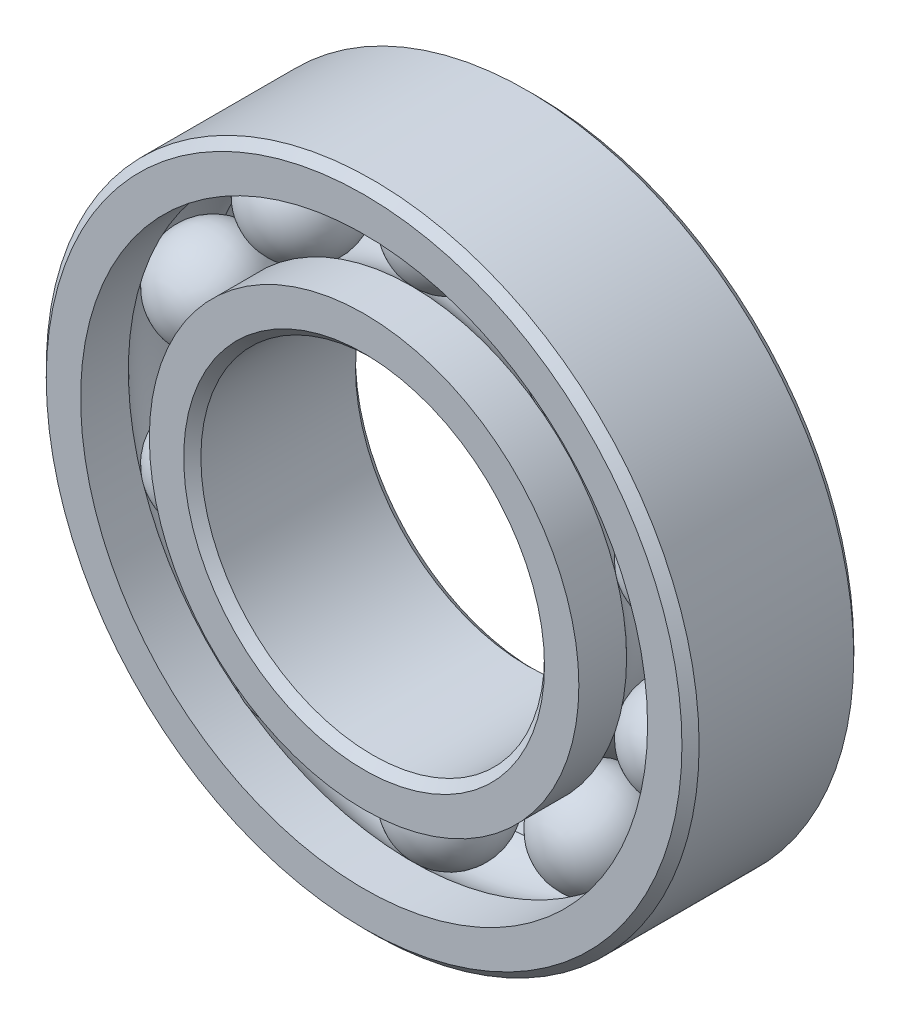
ISO-10303-21;
HEADER;
FILE_DESCRIPTION(('STEP AP214'),'2;1');
FILE_NAME('part.step','',(''),(''),'','','');
FILE_SCHEMA(('AUTOMOTIVE_DESIGN { 1 0 10303 214 1 1 1 1 }'));
ENDSEC;
DATA;
#1=APPLICATION_CONTEXT('core data for automotive mechanical design processes');
#2=APPLICATION_PROTOCOL_DEFINITION('international standard','automotive_design',2000,#1);
#3=PRODUCT_CONTEXT('',#1,'mechanical');
#4=PRODUCT('Part','Part','',(#3));
#5=PRODUCT_RELATED_PRODUCT_CATEGORY('part','',(#4));
#6=PRODUCT_DEFINITION_FORMATION('','',#4);
#7=PRODUCT_DEFINITION_CONTEXT('part definition',#1,'design');
#8=PRODUCT_DEFINITION('design','',#6,#7);
#9=PRODUCT_DEFINITION_SHAPE('','',#8);
#10=(LENGTH_UNIT() NAMED_UNIT(*) SI_UNIT(.MILLI.,.METRE.));
#11=(NAMED_UNIT(*) PLANE_ANGLE_UNIT() SI_UNIT($,.RADIAN.));
#12=(NAMED_UNIT(*) SI_UNIT($,.STERADIAN.) SOLID_ANGLE_UNIT());
#13=UNCERTAINTY_MEASURE_WITH_UNIT(LENGTH_MEASURE(1.E-05),#10,'distance_accuracy_value','');
#14=(GEOMETRIC_REPRESENTATION_CONTEXT(3) GLOBAL_UNCERTAINTY_ASSIGNED_CONTEXT((#13)) GLOBAL_UNIT_ASSIGNED_CONTEXT((#10,
#11,#12)) REPRESENTATION_CONTEXT('',''));
#15=CARTESIAN_POINT('',(0.,0.,0.));
#16=DIRECTION('',(0.,0.,1.));
#17=DIRECTION('',(1.,0.,0.));
#18=AXIS2_PLACEMENT_3D('',#15,#16,#17);
#19=CARTESIAN_POINT('',(4.26144307912035,5.86537320921842,0.));
#20=DIRECTION('',(0.,0.,1.));
#21=DIRECTION('',(0.587785252292462,0.809016994374955,0.));
#22=AXIS2_PLACEMENT_3D('',#19,#20,#21);
#23=SPHERICAL_SURFACE('',#22,1.49484711634152);
#24=CARTESIAN_POINT('',(4.26144307912035,5.86537320921842,1.49484711634152));
#25=VERTEX_POINT('',#24);
#26=VERTEX_LOOP('',#25);
#27=FACE_BOUND('',#26,.T.);
#28=ADVANCED_FACE('F39',(#27),#23,.T.);
#29=CLOSED_SHELL('',(#28));
#30=MANIFOLD_SOLID_BREP('B2',#29);
#31=CARTESIAN_POINT('',(6.89515974313984,2.24037320921845,0.));
#32=DIRECTION('',(0.,0.,1.));
#33=DIRECTION('',(0.95105651629515,0.309016994374958,0.));
#34=AXIS2_PLACEMENT_3D('',#31,#32,#33);
#35=SPHERICAL_SURFACE('',#34,1.49484711634152);
#36=CARTESIAN_POINT('',(6.89515974313984,2.24037320921845,1.49484711634152));
#37=VERTEX_POINT('',#36);
#38=VERTEX_LOOP('',#37);
#39=FACE_BOUND('',#38,.T.);
#40=ADVANCED_FACE('F59',(#39),#35,.T.);
#41=CLOSED_SHELL('',(#40));
#42=MANIFOLD_SOLID_BREP('B6',#41);
#43=CARTESIAN_POINT('',(6.89515974313988,-2.2403732092183,0.));
#44=DIRECTION('',(0.,0.,1.));
#45=DIRECTION('',(0.951056516295157,-0.309016994374938,0.));
#46=AXIS2_PLACEMENT_3D('',#43,#44,#45);
#47=SPHERICAL_SURFACE('',#46,1.49484711634152);
#48=CARTESIAN_POINT('',(6.89515974313988,-2.2403732092183,1.49484711634152));
#49=VERTEX_POINT('',#48);
#50=VERTEX_LOOP('',#49);
#51=FACE_BOUND('',#50,.T.);
#52=ADVANCED_FACE('F79',(#51),#47,.T.);
#53=CLOSED_SHELL('',(#52));
#54=MANIFOLD_SOLID_BREP('B35',#53);
#55=CARTESIAN_POINT('',(4.26144307912048,-5.86537320921833,0.));
#56=DIRECTION('',(0.,0.,1.));
#57=DIRECTION('',(0.58778525229248,-0.809016994374942,0.));
#58=AXIS2_PLACEMENT_3D('',#55,#56,#57);
#59=SPHERICAL_SURFACE('',#58,1.49484711634152);
#60=CARTESIAN_POINT('',(4.26144307912048,-5.86537320921833,1.49484711634152));
#61=VERTEX_POINT('',#60);
#62=VERTEX_LOOP('',#61);
#63=FACE_BOUND('',#62,.T.);
#64=ADVANCED_FACE('F99',(#63),#59,.T.);
#65=CLOSED_SHELL('',(#64));
#66=MANIFOLD_SOLID_BREP('B55',#65);
#67=CARTESIAN_POINT('',(0.,-7.25,0.));
#68=DIRECTION('',(0.,0.,1.));
#69=DIRECTION('',(0.,-1.,0.));
#70=AXIS2_PLACEMENT_3D('',#67,#68,#69);
#71=SPHERICAL_SURFACE('',#70,1.49484711634152);
#72=CARTESIAN_POINT('',(0.,-7.25,1.49484711634152));
#73=VERTEX_POINT('',#72);
#74=VERTEX_LOOP('',#73);
#75=FACE_BOUND('',#74,.T.);
#76=ADVANCED_FACE('F119',(#75),#71,.T.);
#77=CLOSED_SHELL('',(#76));
#78=MANIFOLD_SOLID_BREP('B75',#77);
#79=CARTESIAN_POINT('',(-4.2614430791204,-5.86537320921839,0.));
#80=DIRECTION('',(0.,0.,1.));
#81=DIRECTION('',(-0.587785252292469,-0.809016994374951,0.));
#82=AXIS2_PLACEMENT_3D('',#79,#80,#81);
#83=SPHERICAL_SURFACE('',#82,1.49484711634152);
#84=CARTESIAN_POINT('',(-4.2614430791204,-5.86537320921839,1.49484711634152));
#85=VERTEX_POINT('',#84);
#86=VERTEX_LOOP('',#85);
#87=FACE_BOUND('',#86,.T.);
#88=ADVANCED_FACE('F139',(#87),#83,.T.);
#89=CLOSED_SHELL('',(#88));
#90=MANIFOLD_SOLID_BREP('B95',#89);
#91=CARTESIAN_POINT('',(-6.89515974313986,-2.2403732092184,0.));
#92=DIRECTION('',(0.,0.,1.));
#93=DIRECTION('',(-0.951056516295152,-0.309016994374952,0.));
#94=AXIS2_PLACEMENT_3D('',#91,#92,#93);
#95=SPHERICAL_SURFACE('',#94,1.49484711634152);
#96=CARTESIAN_POINT('',(-6.89515974313986,-2.2403732092184,1.49484711634152));
#97=VERTEX_POINT('',#96);
#98=VERTEX_LOOP('',#97);
#99=FACE_BOUND('',#98,.T.);
#100=ADVANCED_FACE('F159',(#99),#95,.T.);
#101=CLOSED_SHELL('',(#100));
#102=MANIFOLD_SOLID_BREP('B115',#101);
#103=CARTESIAN_POINT('',(-6.89515974313987,2.24037320921835,0.));
#104=DIRECTION('',(0.,0.,1.));
#105=DIRECTION('',(-0.951056516295155,0.309016994374945,0.));
#106=AXIS2_PLACEMENT_3D('',#103,#104,#105);
#107=SPHERICAL_SURFACE('',#106,1.49484711634152);
#108=CARTESIAN_POINT('',(-6.89515974313987,2.24037320921835,1.49484711634152));
#109=VERTEX_POINT('',#108);
#110=VERTEX_LOOP('',#109);
#111=FACE_BOUND('',#110,.T.);
#112=ADVANCED_FACE('F179',(#111),#107,.T.);
#113=CLOSED_SHELL('',(#112));
#114=MANIFOLD_SOLID_BREP('B135',#113);
#115=CARTESIAN_POINT('',(-4.26144307912044,5.86537320921836,0.));
#116=DIRECTION('',(0.,0.,1.));
#117=DIRECTION('',(-0.587785252292474,0.809016994374947,0.));
#118=AXIS2_PLACEMENT_3D('',#115,#116,#117);
#119=SPHERICAL_SURFACE('',#118,1.49484711634152);
#120=CARTESIAN_POINT('',(-4.26144307912044,5.86537320921836,1.49484711634152));
#121=VERTEX_POINT('',#120);
#122=VERTEX_LOOP('',#121);
#123=FACE_BOUND('',#122,.T.);
#124=ADVANCED_FACE('F199',(#123),#119,.T.);
#125=CLOSED_SHELL('',(#124));
#126=MANIFOLD_SOLID_BREP('B155',#125);
#127=CARTESIAN_POINT('',(0.,7.25,0.));
#128=DIRECTION('',(0.,0.,1.));
#129=DIRECTION('',(0.,1.,0.));
#130=AXIS2_PLACEMENT_3D('',#127,#128,#129);
#131=SPHERICAL_SURFACE('',#130,1.49484711634152);
#132=CARTESIAN_POINT('',(0.,7.25,1.49484711634152));
#133=VERTEX_POINT('',#132);
#134=VERTEX_LOOP('',#133);
#135=FACE_BOUND('',#134,.T.);
#136=ADVANCED_FACE('F221',(#135),#131,.T.);
#137=CLOSED_SHELL('',(#136));
#138=MANIFOLD_SOLID_BREP('B175',#137);
#139=CARTESIAN_POINT('',(0.,6.25,2.5));
#140=DIRECTION('',(0.,0.,-1.));
#141=DIRECTION('',(-1.,0.,0.));
#142=AXIS2_PLACEMENT_3D('',#139,#140,#141);
#143=PLANE('',#142);
#144=CARTESIAN_POINT('',(0.,0.,2.5));
#145=DIRECTION('',(0.,0.,1.));
#146=DIRECTION('',(1.,0.,0.));
#147=AXIS2_PLACEMENT_3D('',#144,#145,#146);
#148=CIRCLE('',#147,5.25);
#149=CARTESIAN_POINT('',(5.25,0.,2.5));
#150=VERTEX_POINT('',#149);
#151=EDGE_CURVE('E268',#150,#150,#148,.T.);
#152=ORIENTED_EDGE('',*,*,#151,.F.);
#153=EDGE_LOOP('',(#152));
#154=FACE_BOUND('',#153,.T.);
#155=CARTESIAN_POINT('',(0.,0.,2.5));
#156=DIRECTION('',(0.,0.,1.));
#157=DIRECTION('',(1.,0.,0.));
#158=AXIS2_PLACEMENT_3D('',#155,#156,#157);
#159=CIRCLE('',#158,6.25);
#160=CARTESIAN_POINT('',(6.25,0.,2.5));
#161=VERTEX_POINT('',#160);
#162=EDGE_CURVE('E220',#161,#161,#159,.T.);
#163=ORIENTED_EDGE('',*,*,#162,.T.);
#164=EDGE_LOOP('',(#163));
#165=FACE_BOUND('',#164,.T.);
#166=ADVANCED_FACE('F240',(#154,#165),#143,.F.);
#167=CARTESIAN_POINT('',(0.,0.,2.5));
#168=DIRECTION('',(0.,0.,1.));
#169=DIRECTION('',(1.,0.,0.));
#170=AXIS2_PLACEMENT_3D('',#167,#168,#169);
#171=CYLINDRICAL_SURFACE('',#170,6.25);
#172=ORIENTED_EDGE('',*,*,#162,.F.);
#173=EDGE_LOOP('',(#172));
#174=FACE_BOUND('',#173,.T.);
#175=CARTESIAN_POINT('',(0.,0.,1.11111111111111));
#176=DIRECTION('',(0.,0.,1.));
#177=DIRECTION('',(1.,0.,0.));
#178=AXIS2_PLACEMENT_3D('',#175,#176,#177);
#179=CIRCLE('',#178,6.25);
#180=CARTESIAN_POINT('',(6.25,0.,1.11111111111111));
#181=VERTEX_POINT('',#180);
#182=EDGE_CURVE('E246',#181,#181,#179,.T.);
#183=ORIENTED_EDGE('',*,*,#182,.T.);
#184=EDGE_LOOP('',(#183));
#185=FACE_BOUND('',#184,.T.);
#186=ADVANCED_FACE('F275',(#174,#185),#171,.T.);
#187=CARTESIAN_POINT('',(0.,0.,0.));
#188=DIRECTION('',(0.,0.,1.));
#189=DIRECTION('',(1.,0.,0.));
#190=AXIS2_PLACEMENT_3D('',#187,#188,#189);
#191=TOROIDAL_SURFACE('',#190,7.25,1.49484711634152);
#192=ORIENTED_EDGE('',*,*,#182,.F.);
#193=EDGE_LOOP('',(#192));
#194=FACE_BOUND('',#193,.T.);
#195=CARTESIAN_POINT('',(0.,0.,-1.11111111111111));
#196=DIRECTION('',(0.,0.,1.));
#197=DIRECTION('',(1.,0.,0.));
#198=AXIS2_PLACEMENT_3D('',#195,#196,#197);
#199=CIRCLE('',#198,6.25);
#200=CARTESIAN_POINT('',(6.25,0.,-1.11111111111111));
#201=VERTEX_POINT('',#200);
#202=EDGE_CURVE('E250',#201,#201,#199,.T.);
#203=ORIENTED_EDGE('',*,*,#202,.T.);
#204=EDGE_LOOP('',(#203));
#205=FACE_BOUND('',#204,.T.);
#206=ADVANCED_FACE('F279',(#194,#205),#191,.F.);
#207=CARTESIAN_POINT('',(0.,0.,2.5));
#208=DIRECTION('',(0.,0.,1.));
#209=DIRECTION('',(1.,0.,0.));
#210=AXIS2_PLACEMENT_3D('',#207,#208,#209);
#211=CYLINDRICAL_SURFACE('',#210,6.25);
#212=ORIENTED_EDGE('',*,*,#202,.F.);
#213=EDGE_LOOP('',(#212));
#214=FACE_BOUND('',#213,.T.);
#215=CARTESIAN_POINT('',(0.,0.,-2.5));
#216=DIRECTION('',(0.,0.,1.));
#217=DIRECTION('',(1.,0.,0.));
#218=AXIS2_PLACEMENT_3D('',#215,#216,#217);
#219=CIRCLE('',#218,6.25);
#220=CARTESIAN_POINT('',(6.25,0.,-2.5));
#221=VERTEX_POINT('',#220);
#222=EDGE_CURVE('E254',#221,#221,#219,.T.);
#223=ORIENTED_EDGE('',*,*,#222,.T.);
#224=EDGE_LOOP('',(#223));
#225=FACE_BOUND('',#224,.T.);
#226=ADVANCED_FACE('F284',(#214,#225),#211,.T.);
#227=CARTESIAN_POINT('',(0.,5.25,-2.5));
#228=DIRECTION('',(0.,0.,1.));
#229=DIRECTION('',(1.,0.,0.));
#230=AXIS2_PLACEMENT_3D('',#227,#228,#229);
#231=PLANE('',#230);
#232=ORIENTED_EDGE('',*,*,#222,.F.);
#233=EDGE_LOOP('',(#232));
#234=FACE_BOUND('',#233,.T.);
#235=CARTESIAN_POINT('',(0.,0.,-2.5));
#236=DIRECTION('',(0.,0.,1.));
#237=DIRECTION('',(1.,0.,0.));
#238=AXIS2_PLACEMENT_3D('',#235,#236,#237);
#239=CIRCLE('',#238,5.25);
#240=CARTESIAN_POINT('',(5.25,0.,-2.5));
#241=VERTEX_POINT('',#240);
#242=EDGE_CURVE('E259',#241,#241,#239,.T.);
#243=ORIENTED_EDGE('',*,*,#242,.T.);
#244=EDGE_LOOP('',(#243));
#245=FACE_BOUND('',#244,.T.);
#246=ADVANCED_FACE('F290',(#234,#245),#231,.F.);
#247=CARTESIAN_POINT('',(0.,0.,-2.25));
#248=DIRECTION('',(0.,0.,-1.));
#249=DIRECTION('',(-1.,0.,0.));
#250=AXIS2_PLACEMENT_3D('',#247,#248,#249);
#251=CONICAL_SURFACE('',#250,5.,0.785398163397438);
#252=ORIENTED_EDGE('',*,*,#242,.F.);
#253=EDGE_LOOP('',(#252));
#254=FACE_BOUND('',#253,.T.);
#255=CARTESIAN_POINT('',(0.,0.,-2.25));
#256=DIRECTION('',(0.,0.,1.));
#257=DIRECTION('',(1.,0.,0.));
#258=AXIS2_PLACEMENT_3D('',#255,#256,#257);
#259=CIRCLE('',#258,5.);
#260=CARTESIAN_POINT('',(5.,0.,-2.25));
#261=VERTEX_POINT('',#260);
#262=EDGE_CURVE('E262',#261,#261,#259,.T.);
#263=ORIENTED_EDGE('',*,*,#262,.T.);
#264=EDGE_LOOP('',(#263));
#265=FACE_BOUND('',#264,.T.);
#266=ADVANCED_FACE('F294',(#254,#265),#251,.F.);
#267=CARTESIAN_POINT('',(0.,0.,2.5));
#268=DIRECTION('',(0.,0.,1.));
#269=DIRECTION('',(1.,0.,0.));
#270=AXIS2_PLACEMENT_3D('',#267,#268,#269);
#271=CYLINDRICAL_SURFACE('',#270,5.);
#272=ORIENTED_EDGE('',*,*,#262,.F.);
#273=EDGE_LOOP('',(#272));
#274=FACE_BOUND('',#273,.T.);
#275=CARTESIAN_POINT('',(0.,0.,2.25000000000001));
#276=DIRECTION('',(0.,0.,1.));
#277=DIRECTION('',(1.,0.,0.));
#278=AXIS2_PLACEMENT_3D('',#275,#276,#277);
#279=CIRCLE('',#278,5.);
#280=CARTESIAN_POINT('',(5.,0.,2.25000000000001));
#281=VERTEX_POINT('',#280);
#282=EDGE_CURVE('E265',#281,#281,#279,.T.);
#283=ORIENTED_EDGE('',*,*,#282,.T.);
#284=EDGE_LOOP('',(#283));
#285=FACE_BOUND('',#284,.T.);
#286=ADVANCED_FACE('F298',(#274,#285),#271,.F.);
#287=CARTESIAN_POINT('',(0.,0.,2.5));
#288=DIRECTION('',(0.,0.,1.));
#289=DIRECTION('',(1.,0.,0.));
#290=AXIS2_PLACEMENT_3D('',#287,#288,#289);
#291=CONICAL_SURFACE('',#290,5.25,0.785398163397458);
#292=ORIENTED_EDGE('',*,*,#282,.F.);
#293=EDGE_LOOP('',(#292));
#294=FACE_BOUND('',#293,.T.);
#295=ORIENTED_EDGE('',*,*,#151,.T.);
#296=EDGE_LOOP('',(#295));
#297=FACE_BOUND('',#296,.T.);
#298=ADVANCED_FACE('F272',(#294,#297),#291,.F.);
#299=CLOSED_SHELL('',(#166,#186,#206,#226,#246,#266,#286,#298));
#300=MANIFOLD_SOLID_BREP('B195',#299);
#301=CARTESIAN_POINT('',(0.,0.,2.25));
#302=DIRECTION('',(0.,0.,-1.));
#303=DIRECTION('',(-1.,0.,0.));
#304=AXIS2_PLACEMENT_3D('',#301,#302,#303);
#305=CONICAL_SURFACE('',#304,9.5,0.785398163397443);
#306=CARTESIAN_POINT('',(0.,0.,2.5));
#307=DIRECTION('',(0.,0.,1.));
#308=DIRECTION('',(1.,0.,0.));
#309=AXIS2_PLACEMENT_3D('',#306,#307,#308);
#310=CIRCLE('',#309,9.25);
#311=CARTESIAN_POINT('',(9.25,0.,2.5));
#312=VERTEX_POINT('',#311);
#313=EDGE_CURVE('E389',#312,#312,#310,.T.);
#314=ORIENTED_EDGE('',*,*,#313,.F.);
#315=EDGE_LOOP('',(#314));
#316=FACE_BOUND('',#315,.T.);
#317=CARTESIAN_POINT('',(0.,0.,2.25));
#318=DIRECTION('',(0.,0.,1.));
#319=DIRECTION('',(1.,0.,0.));
#320=AXIS2_PLACEMENT_3D('',#317,#318,#319);
#321=CIRCLE('',#320,9.5);
#322=CARTESIAN_POINT('',(9.5,0.,2.25));
#323=VERTEX_POINT('',#322);
#324=EDGE_CURVE('E239',#323,#323,#321,.T.);
#325=ORIENTED_EDGE('',*,*,#324,.T.);
#326=EDGE_LOOP('',(#325));
#327=FACE_BOUND('',#326,.T.);
#328=ADVANCED_FACE('F361',(#316,#327),#305,.T.);
#329=CARTESIAN_POINT('',(0.,0.,2.5));
#330=DIRECTION('',(0.,0.,1.));
#331=DIRECTION('',(1.,0.,0.));
#332=AXIS2_PLACEMENT_3D('',#329,#330,#331);
#333=CYLINDRICAL_SURFACE('',#332,9.5);
#334=ORIENTED_EDGE('',*,*,#324,.F.);
#335=EDGE_LOOP('',(#334));
#336=FACE_BOUND('',#335,.T.);
#337=CARTESIAN_POINT('',(0.,0.,-2.25));
#338=DIRECTION('',(0.,0.,1.));
#339=DIRECTION('',(1.,0.,0.));
#340=AXIS2_PLACEMENT_3D('',#337,#338,#339);
#341=CIRCLE('',#340,9.5);
#342=CARTESIAN_POINT('',(9.5,0.,-2.25));
#343=VERTEX_POINT('',#342);
#344=EDGE_CURVE('E367',#343,#343,#341,.T.);
#345=ORIENTED_EDGE('',*,*,#344,.T.);
#346=EDGE_LOOP('',(#345));
#347=FACE_BOUND('',#346,.T.);
#348=ADVANCED_FACE('F396',(#336,#347),#333,.T.);
#349=CARTESIAN_POINT('',(0.,0.,-2.5));
#350=DIRECTION('',(0.,0.,1.));
#351=DIRECTION('',(1.,0.,0.));
#352=AXIS2_PLACEMENT_3D('',#349,#350,#351);
#353=CONICAL_SURFACE('',#352,9.25,0.785398163397442);
#354=ORIENTED_EDGE('',*,*,#344,.F.);
#355=EDGE_LOOP('',(#354));
#356=FACE_BOUND('',#355,.T.);
#357=CARTESIAN_POINT('',(0.,0.,-2.5));
#358=DIRECTION('',(0.,0.,1.));
#359=DIRECTION('',(1.,0.,0.));
#360=AXIS2_PLACEMENT_3D('',#357,#358,#359);
#361=CIRCLE('',#360,9.25);
#362=CARTESIAN_POINT('',(9.25,0.,-2.5));
#363=VERTEX_POINT('',#362);
#364=EDGE_CURVE('E371',#363,#363,#361,.T.);
#365=ORIENTED_EDGE('',*,*,#364,.T.);
#366=EDGE_LOOP('',(#365));
#367=FACE_BOUND('',#366,.T.);
#368=ADVANCED_FACE('F400',(#356,#367),#353,.T.);
#369=CARTESIAN_POINT('',(0.,9.25,-2.5));
#370=DIRECTION('',(0.,0.,1.));
#371=DIRECTION('',(1.,0.,0.));
#372=AXIS2_PLACEMENT_3D('',#369,#370,#371);
#373=PLANE('',#372);
#374=ORIENTED_EDGE('',*,*,#364,.F.);
#375=EDGE_LOOP('',(#374));
#376=FACE_BOUND('',#375,.T.);
#377=CARTESIAN_POINT('',(0.,0.,-2.5));
#378=DIRECTION('',(0.,0.,1.));
#379=DIRECTION('',(1.,0.,0.));
#380=AXIS2_PLACEMENT_3D('',#377,#378,#379);
#381=CIRCLE('',#380,8.25);
#382=CARTESIAN_POINT('',(8.25,0.,-2.5));
#383=VERTEX_POINT('',#382);
#384=EDGE_CURVE('E375',#383,#383,#381,.T.);
#385=ORIENTED_EDGE('',*,*,#384,.T.);
#386=EDGE_LOOP('',(#385));
#387=FACE_BOUND('',#386,.T.);
#388=ADVANCED_FACE('F405',(#376,#387),#373,.F.);
#389=CARTESIAN_POINT('',(0.,0.,2.5));
#390=DIRECTION('',(0.,0.,1.));
#391=DIRECTION('',(1.,0.,0.));
#392=AXIS2_PLACEMENT_3D('',#389,#390,#391);
#393=CYLINDRICAL_SURFACE('',#392,8.25);
#394=ORIENTED_EDGE('',*,*,#384,.F.);
#395=EDGE_LOOP('',(#394));
#396=FACE_BOUND('',#395,.T.);
#397=CARTESIAN_POINT('',(0.,0.,-1.11111111111111));
#398=DIRECTION('',(0.,0.,1.));
#399=DIRECTION('',(1.,0.,0.));
#400=AXIS2_PLACEMENT_3D('',#397,#398,#399);
#401=CIRCLE('',#400,8.25);
#402=CARTESIAN_POINT('',(8.25,0.,-1.11111111111111));
#403=VERTEX_POINT('',#402);
#404=EDGE_CURVE('E380',#403,#403,#401,.T.);
#405=ORIENTED_EDGE('',*,*,#404,.T.);
#406=EDGE_LOOP('',(#405));
#407=FACE_BOUND('',#406,.T.);
#408=ADVANCED_FACE('F411',(#396,#407),#393,.F.);
#409=CARTESIAN_POINT('',(0.,0.,0.));
#410=DIRECTION('',(0.,0.,1.));
#411=DIRECTION('',(1.,0.,0.));
#412=AXIS2_PLACEMENT_3D('',#409,#410,#411);
#413=TOROIDAL_SURFACE('',#412,7.25,1.49484711634152);
#414=ORIENTED_EDGE('',*,*,#404,.F.);
#415=EDGE_LOOP('',(#414));
#416=FACE_BOUND('',#415,.T.);
#417=CARTESIAN_POINT('',(0.,0.,1.11111111111111));
#418=DIRECTION('',(0.,0.,1.));
#419=DIRECTION('',(1.,0.,0.));
#420=AXIS2_PLACEMENT_3D('',#417,#418,#419);
#421=CIRCLE('',#420,8.25);
#422=CARTESIAN_POINT('',(8.25,0.,1.11111111111111));
#423=VERTEX_POINT('',#422);
#424=EDGE_CURVE('E383',#423,#423,#421,.T.);
#425=ORIENTED_EDGE('',*,*,#424,.T.);
#426=EDGE_LOOP('',(#425));
#427=FACE_BOUND('',#426,.T.);
#428=ADVANCED_FACE('F415',(#416,#427),#413,.F.);
#429=CARTESIAN_POINT('',(0.,0.,2.5));
#430=DIRECTION('',(0.,0.,1.));
#431=DIRECTION('',(1.,0.,0.));
#432=AXIS2_PLACEMENT_3D('',#429,#430,#431);
#433=CYLINDRICAL_SURFACE('',#432,8.25);
#434=ORIENTED_EDGE('',*,*,#424,.F.);
#435=EDGE_LOOP('',(#434));
#436=FACE_BOUND('',#435,.T.);
#437=CARTESIAN_POINT('',(0.,0.,2.5));
#438=DIRECTION('',(0.,0.,1.));
#439=DIRECTION('',(1.,0.,0.));
#440=AXIS2_PLACEMENT_3D('',#437,#438,#439);
#441=CIRCLE('',#440,8.25);
#442=CARTESIAN_POINT('',(8.25,0.,2.5));
#443=VERTEX_POINT('',#442);
#444=EDGE_CURVE('E386',#443,#443,#441,.T.);
#445=ORIENTED_EDGE('',*,*,#444,.T.);
#446=EDGE_LOOP('',(#445));
#447=FACE_BOUND('',#446,.T.);
#448=ADVANCED_FACE('F419',(#436,#447),#433,.F.);
#449=CARTESIAN_POINT('',(0.,9.25,2.5));
#450=DIRECTION('',(0.,0.,-1.));
#451=DIRECTION('',(-1.,0.,0.));
#452=AXIS2_PLACEMENT_3D('',#449,#450,#451);
#453=PLANE('',#452);
#454=ORIENTED_EDGE('',*,*,#444,.F.);
#455=EDGE_LOOP('',(#454));
#456=FACE_BOUND('',#455,.T.);
#457=ORIENTED_EDGE('',*,*,#313,.T.);
#458=EDGE_LOOP('',(#457));
#459=FACE_BOUND('',#458,.T.);
#460=ADVANCED_FACE('F393',(#456,#459),#453,.F.);
#461=CLOSED_SHELL('',(#328,#348,#368,#388,#408,#428,#448,#460));
#462=MANIFOLD_SOLID_BREP('B215',#461);
#463=ADVANCED_BREP_SHAPE_REPRESENTATION('',(#18,#30,#42,#54,#66,#78,#90,#102,#114,#126,#138,
#300,#462),#14);
#464=SHAPE_DEFINITION_REPRESENTATION(#9,#463);
ENDSEC;
END-ISO-10303-21;
